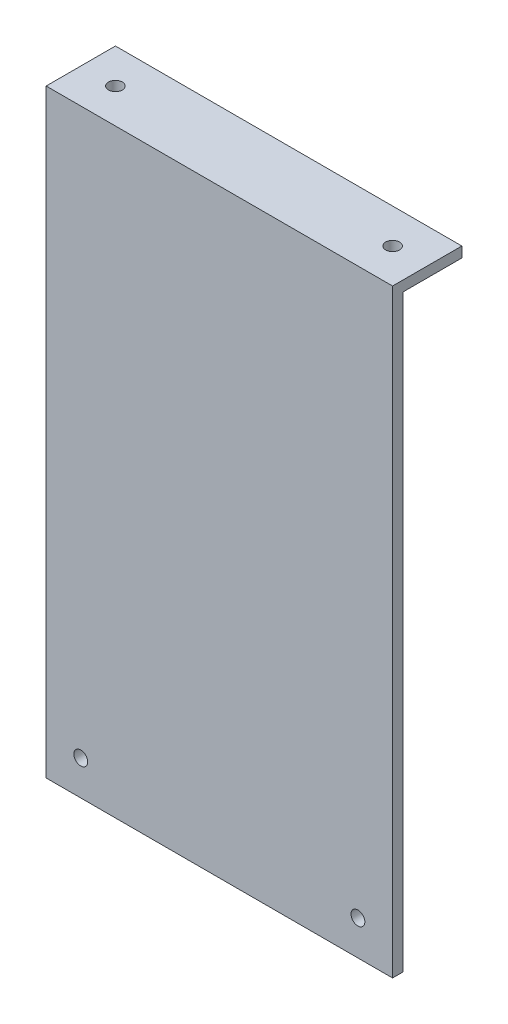
ISO-10303-21;
HEADER;
FILE_DESCRIPTION(('STEP AP214'),'2;1');
FILE_NAME('part.step','',(''),(''),'','','');
FILE_SCHEMA(('AUTOMOTIVE_DESIGN { 1 0 10303 214 1 1 1 1 }'));
ENDSEC;
DATA;
#1=APPLICATION_CONTEXT('core data for automotive mechanical design processes');
#2=APPLICATION_PROTOCOL_DEFINITION('international standard','automotive_design',2000,#1);
#3=PRODUCT_CONTEXT('',#1,'mechanical');
#4=PRODUCT('Part','Part','',(#3));
#5=PRODUCT_RELATED_PRODUCT_CATEGORY('part','',(#4));
#6=PRODUCT_DEFINITION_FORMATION('','',#4);
#7=PRODUCT_DEFINITION_CONTEXT('part definition',#1,'design');
#8=PRODUCT_DEFINITION('design','',#6,#7);
#9=PRODUCT_DEFINITION_SHAPE('','',#8);
#10=(LENGTH_UNIT() NAMED_UNIT(*) SI_UNIT(.MILLI.,.METRE.));
#11=(NAMED_UNIT(*) PLANE_ANGLE_UNIT() SI_UNIT($,.RADIAN.));
#12=(NAMED_UNIT(*) SI_UNIT($,.STERADIAN.) SOLID_ANGLE_UNIT());
#13=UNCERTAINTY_MEASURE_WITH_UNIT(LENGTH_MEASURE(1.E-05),#10,'distance_accuracy_value','');
#14=(GEOMETRIC_REPRESENTATION_CONTEXT(3) GLOBAL_UNCERTAINTY_ASSIGNED_CONTEXT((#13)) GLOBAL_UNIT_ASSIGNED_CONTEXT((#10,
#11,#12)) REPRESENTATION_CONTEXT('',''));
#15=CARTESIAN_POINT('',(0.,0.,0.));
#16=DIRECTION('',(0.,0.,1.));
#17=DIRECTION('',(1.,0.,0.));
#18=AXIS2_PLACEMENT_3D('',#15,#16,#17);
#19=CARTESIAN_POINT('',(50.,3.,10.));
#20=DIRECTION('',(-1.,0.,0.));
#21=DIRECTION('',(0.,0.,1.));
#22=AXIS2_PLACEMENT_3D('',#19,#20,#21);
#23=PLANE('',#22);
#24=DIRECTION('',(0.,-1.,0.));
#25=VECTOR('',#24,1.);
#26=CARTESIAN_POINT('',(50.,3.,10.));
#27=LINE('',#26,#25);
#28=CARTESIAN_POINT('',(50.,3.,10.));
#29=VERTEX_POINT('',#28);
#30=CARTESIAN_POINT('',(50.,-170.,10.));
#31=VERTEX_POINT('',#30);
#32=EDGE_CURVE('E161',#29,#31,#27,.T.);
#33=ORIENTED_EDGE('',*,*,#32,.T.);
#34=DIRECTION('',(0.,0.,1.));
#35=VECTOR('',#34,1.);
#36=CARTESIAN_POINT('',(50.,-170.,10.));
#37=LINE('',#36,#35);
#38=CARTESIAN_POINT('',(50.,-170.,7.));
#39=VERTEX_POINT('',#38);
#40=EDGE_CURVE('E114',#39,#31,#37,.T.);
#41=ORIENTED_EDGE('',*,*,#40,.F.);
#42=DIRECTION('',(0.,1.,0.));
#43=VECTOR('',#42,1.);
#44=CARTESIAN_POINT('',(50.,-170.,7.));
#45=LINE('',#44,#43);
#46=CARTESIAN_POINT('',(50.,0.,7.));
#47=VERTEX_POINT('',#46);
#48=EDGE_CURVE('E109',#39,#47,#45,.T.);
#49=ORIENTED_EDGE('',*,*,#48,.T.);
#50=DIRECTION('',(0.,0.,-1.));
#51=VECTOR('',#50,1.);
#52=CARTESIAN_POINT('',(50.,0.,10.));
#53=LINE('',#52,#51);
#54=CARTESIAN_POINT('',(50.,0.,-10.));
#55=VERTEX_POINT('',#54);
#56=EDGE_CURVE('E143',#47,#55,#53,.T.);
#57=ORIENTED_EDGE('',*,*,#56,.T.);
#58=DIRECTION('',(0.,-1.,0.));
#59=VECTOR('',#58,1.);
#60=CARTESIAN_POINT('',(50.,3.,-10.));
#61=LINE('',#60,#59);
#62=CARTESIAN_POINT('',(50.,3.,-10.));
#63=VERTEX_POINT('',#62);
#64=EDGE_CURVE('E11',#63,#55,#61,.T.);
#65=ORIENTED_EDGE('',*,*,#64,.F.);
#66=DIRECTION('',(0.,0.,-1.));
#67=VECTOR('',#66,1.);
#68=CARTESIAN_POINT('',(50.,3.,10.));
#69=LINE('',#68,#67);
#70=EDGE_CURVE('E151',#29,#63,#69,.T.);
#71=ORIENTED_EDGE('',*,*,#70,.F.);
#72=EDGE_LOOP('',(#33,#41,#49,#57,#65,#71));
#73=FACE_BOUND('',#72,.T.);
#74=ADVANCED_FACE('F42',(#73),#23,.F.);
#75=CARTESIAN_POINT('',(-50.,3.,-10.));
#76=DIRECTION('',(0.,0.,1.));
#77=DIRECTION('',(1.,0.,0.));
#78=AXIS2_PLACEMENT_3D('',#75,#76,#77);
#79=PLANE('',#78);
#80=DIRECTION('',(-1.,0.,0.));
#81=VECTOR('',#80,1.);
#82=CARTESIAN_POINT('',(-50.,0.,-10.));
#83=LINE('',#82,#81);
#84=CARTESIAN_POINT('',(-50.,0.,-10.));
#85=VERTEX_POINT('',#84);
#86=EDGE_CURVE('E81',#55,#85,#83,.T.);
#87=ORIENTED_EDGE('',*,*,#86,.T.);
#88=DIRECTION('',(0.,-1.,0.));
#89=VECTOR('',#88,1.);
#90=CARTESIAN_POINT('',(-50.,3.,-10.));
#91=LINE('',#90,#89);
#92=CARTESIAN_POINT('',(-50.,3.,-10.));
#93=VERTEX_POINT('',#92);
#94=EDGE_CURVE('E50',#93,#85,#91,.T.);
#95=ORIENTED_EDGE('',*,*,#94,.F.);
#96=DIRECTION('',(-1.,0.,0.));
#97=VECTOR('',#96,1.);
#98=CARTESIAN_POINT('',(-50.,3.,-10.));
#99=LINE('',#98,#97);
#100=EDGE_CURVE('E86',#63,#93,#99,.T.);
#101=ORIENTED_EDGE('',*,*,#100,.F.);
#102=ORIENTED_EDGE('',*,*,#64,.T.);
#103=EDGE_LOOP('',(#87,#95,#101,#102));
#104=FACE_BOUND('',#103,.T.);
#105=ADVANCED_FACE('F177',(#104),#79,.F.);
#106=CARTESIAN_POINT('',(-50.,3.,10.));
#107=DIRECTION('',(1.,0.,0.));
#108=DIRECTION('',(0.,0.,-1.));
#109=AXIS2_PLACEMENT_3D('',#106,#107,#108);
#110=PLANE('',#109);
#111=DIRECTION('',(0.,0.,1.));
#112=VECTOR('',#111,1.);
#113=CARTESIAN_POINT('',(-50.,0.,10.));
#114=LINE('',#113,#112);
#115=CARTESIAN_POINT('',(-50.,0.,7.));
#116=VERTEX_POINT('',#115);
#117=EDGE_CURVE('E127',#85,#116,#114,.T.);
#118=ORIENTED_EDGE('',*,*,#117,.T.);
#119=DIRECTION('',(0.,1.,0.));
#120=VECTOR('',#119,1.);
#121=CARTESIAN_POINT('',(-50.,-170.,7.));
#122=LINE('',#121,#120);
#123=CARTESIAN_POINT('',(-50.,-170.,7.));
#124=VERTEX_POINT('',#123);
#125=EDGE_CURVE('E107',#124,#116,#122,.T.);
#126=ORIENTED_EDGE('',*,*,#125,.F.);
#127=DIRECTION('',(0.,0.,-1.));
#128=VECTOR('',#127,1.);
#129=CARTESIAN_POINT('',(-50.,-170.,10.));
#130=LINE('',#129,#128);
#131=CARTESIAN_POINT('',(-50.,-170.,10.));
#132=VERTEX_POINT('',#131);
#133=EDGE_CURVE('E115',#132,#124,#130,.T.);
#134=ORIENTED_EDGE('',*,*,#133,.F.);
#135=DIRECTION('',(0.,-1.,0.));
#136=VECTOR('',#135,1.);
#137=CARTESIAN_POINT('',(-50.,3.,10.));
#138=LINE('',#137,#136);
#139=CARTESIAN_POINT('',(-50.,3.,10.));
#140=VERTEX_POINT('',#139);
#141=EDGE_CURVE('E170',#140,#132,#138,.T.);
#142=ORIENTED_EDGE('',*,*,#141,.F.);
#143=DIRECTION('',(0.,0.,1.));
#144=VECTOR('',#143,1.);
#145=CARTESIAN_POINT('',(-50.,3.,10.));
#146=LINE('',#145,#144);
#147=EDGE_CURVE('E156',#93,#140,#146,.T.);
#148=ORIENTED_EDGE('',*,*,#147,.F.);
#149=ORIENTED_EDGE('',*,*,#94,.T.);
#150=EDGE_LOOP('',(#118,#126,#134,#142,#148,#149));
#151=FACE_BOUND('',#150,.T.);
#152=ADVANCED_FACE('F126',(#151),#110,.F.);
#153=CARTESIAN_POINT('',(-50.,3.,10.));
#154=DIRECTION('',(0.,0.,-1.));
#155=DIRECTION('',(-1.,0.,0.));
#156=AXIS2_PLACEMENT_3D('',#153,#154,#155);
#157=PLANE('',#156);
#158=CARTESIAN_POINT('',(-40.,-160.,10.));
#159=DIRECTION('',(0.,0.,1.));
#160=DIRECTION('',(1.,0.,0.));
#161=AXIS2_PLACEMENT_3D('',#158,#159,#160);
#162=CIRCLE('',#161,2.);
#163=CARTESIAN_POINT('',(-38.,-160.,10.));
#164=VERTEX_POINT('',#163);
#165=EDGE_CURVE('E188',#164,#164,#162,.T.);
#166=ORIENTED_EDGE('',*,*,#165,.F.);
#167=EDGE_LOOP('',(#166));
#168=FACE_BOUND('',#167,.T.);
#169=CARTESIAN_POINT('',(40.,-160.,10.));
#170=DIRECTION('',(0.,0.,1.));
#171=DIRECTION('',(1.,0.,0.));
#172=AXIS2_PLACEMENT_3D('',#169,#170,#171);
#173=CIRCLE('',#172,2.);
#174=CARTESIAN_POINT('',(42.,-160.,10.));
#175=VERTEX_POINT('',#174);
#176=EDGE_CURVE('E194',#175,#175,#173,.T.);
#177=ORIENTED_EDGE('',*,*,#176,.F.);
#178=EDGE_LOOP('',(#177));
#179=FACE_BOUND('',#178,.T.);
#180=ORIENTED_EDGE('',*,*,#141,.T.);
#181=DIRECTION('',(-1.,0.,0.));
#182=VECTOR('',#181,1.);
#183=CARTESIAN_POINT('',(-50.,-170.,10.));
#184=LINE('',#183,#182);
#185=EDGE_CURVE('E121',#31,#132,#184,.T.);
#186=ORIENTED_EDGE('',*,*,#185,.F.);
#187=ORIENTED_EDGE('',*,*,#32,.F.);
#188=DIRECTION('',(1.,0.,0.));
#189=VECTOR('',#188,1.);
#190=CARTESIAN_POINT('',(-50.,3.,10.));
#191=LINE('',#190,#189);
#192=EDGE_CURVE('E66',#140,#29,#191,.T.);
#193=ORIENTED_EDGE('',*,*,#192,.F.);
#194=EDGE_LOOP('',(#180,#186,#187,#193));
#195=FACE_BOUND('',#194,.T.);
#196=ADVANCED_FACE('F208',(#168,#179,#195),#157,.F.);
#197=CARTESIAN_POINT('',(0.,3.,0.));
#198=DIRECTION('',(0.,-1.,0.));
#199=DIRECTION('',(0.,0.,-1.));
#200=AXIS2_PLACEMENT_3D('',#197,#198,#199);
#201=PLANE('',#200);
#202=CARTESIAN_POINT('',(40.,3.,0.));
#203=DIRECTION('',(0.,1.,0.));
#204=DIRECTION('',(0.,0.,1.));
#205=AXIS2_PLACEMENT_3D('',#202,#203,#204);
#206=CIRCLE('',#205,2.);
#207=CARTESIAN_POINT('',(40.,3.,2.));
#208=VERTEX_POINT('',#207);
#209=EDGE_CURVE('E139',#208,#208,#206,.T.);
#210=ORIENTED_EDGE('',*,*,#209,.F.);
#211=EDGE_LOOP('',(#210));
#212=FACE_BOUND('',#211,.T.);
#213=CARTESIAN_POINT('',(-40.,3.,0.));
#214=DIRECTION('',(0.,1.,0.));
#215=DIRECTION('',(0.,0.,1.));
#216=AXIS2_PLACEMENT_3D('',#213,#214,#215);
#217=CIRCLE('',#216,2.);
#218=CARTESIAN_POINT('',(-40.,3.,2.));
#219=VERTEX_POINT('',#218);
#220=EDGE_CURVE('E129',#219,#219,#217,.T.);
#221=ORIENTED_EDGE('',*,*,#220,.F.);
#222=EDGE_LOOP('',(#221));
#223=FACE_BOUND('',#222,.T.);
#224=ORIENTED_EDGE('',*,*,#70,.T.);
#225=ORIENTED_EDGE('',*,*,#100,.T.);
#226=ORIENTED_EDGE('',*,*,#147,.T.);
#227=ORIENTED_EDGE('',*,*,#192,.T.);
#228=EDGE_LOOP('',(#224,#225,#226,#227));
#229=FACE_BOUND('',#228,.T.);
#230=ADVANCED_FACE('F211',(#212,#223,#229),#201,.F.);
#231=CARTESIAN_POINT('',(0.,0.,0.));
#232=DIRECTION('',(0.,-1.,0.));
#233=DIRECTION('',(0.,0.,-1.));
#234=AXIS2_PLACEMENT_3D('',#231,#232,#233);
#235=PLANE('',#234);
#236=DIRECTION('',(1.,0.,0.));
#237=VECTOR('',#236,1.);
#238=CARTESIAN_POINT('',(-50.,0.,7.));
#239=LINE('',#238,#237);
#240=EDGE_CURVE('E57',#116,#47,#239,.T.);
#241=ORIENTED_EDGE('',*,*,#240,.F.);
#242=ORIENTED_EDGE('',*,*,#117,.F.);
#243=ORIENTED_EDGE('',*,*,#86,.F.);
#244=ORIENTED_EDGE('',*,*,#56,.F.);
#245=EDGE_LOOP('',(#241,#242,#243,#244));
#246=FACE_BOUND('',#245,.T.);
#247=CARTESIAN_POINT('',(40.,0.,0.));
#248=DIRECTION('',(0.,-1.,0.));
#249=DIRECTION('',(0.,0.,-1.));
#250=AXIS2_PLACEMENT_3D('',#247,#248,#249);
#251=CIRCLE('',#250,2.);
#252=CARTESIAN_POINT('',(40.,0.,2.));
#253=VERTEX_POINT('',#252);
#254=EDGE_CURVE('E144',#253,#253,#251,.F.);
#255=ORIENTED_EDGE('',*,*,#254,.T.);
#256=EDGE_LOOP('',(#255));
#257=FACE_BOUND('',#256,.T.);
#258=CARTESIAN_POINT('',(-40.,0.,0.));
#259=DIRECTION('',(0.,-1.,0.));
#260=DIRECTION('',(0.,0.,-1.));
#261=AXIS2_PLACEMENT_3D('',#258,#259,#260);
#262=CIRCLE('',#261,2.);
#263=CARTESIAN_POINT('',(-40.,0.,2.));
#264=VERTEX_POINT('',#263);
#265=EDGE_CURVE('E134',#264,#264,#262,.F.);
#266=ORIENTED_EDGE('',*,*,#265,.T.);
#267=EDGE_LOOP('',(#266));
#268=FACE_BOUND('',#267,.T.);
#269=ADVANCED_FACE('F174',(#246,#257,#268),#235,.T.);
#270=CARTESIAN_POINT('',(-40.,-0.00100000000000013,0.));
#271=DIRECTION('',(0.,1.,0.));
#272=DIRECTION('',(0.,0.,1.));
#273=AXIS2_PLACEMENT_3D('',#270,#271,#272);
#274=CYLINDRICAL_SURFACE('',#273,2.);
#275=CARTESIAN_POINT('',(-40.,0.,2.));
#276=CARTESIAN_POINT('',(-40.,0.03125,2.));
#277=CARTESIAN_POINT('',(-40.,0.0625,2.));
#278=CARTESIAN_POINT('',(-40.,0.125,2.));
#279=CARTESIAN_POINT('',(-40.,0.15625,2.));
#280=CARTESIAN_POINT('',(-40.,0.21875,2.));
#281=CARTESIAN_POINT('',(-40.,0.25,2.));
#282=CARTESIAN_POINT('',(-40.,0.3125,2.));
#283=CARTESIAN_POINT('',(-40.,0.34375,2.));
#284=CARTESIAN_POINT('',(-40.,0.40625,2.));
#285=CARTESIAN_POINT('',(-40.,0.4375,2.));
#286=CARTESIAN_POINT('',(-40.,0.5,2.));
#287=CARTESIAN_POINT('',(-40.,0.53125,2.));
#288=CARTESIAN_POINT('',(-40.,0.59375,2.));
#289=CARTESIAN_POINT('',(-40.,0.625,2.));
#290=CARTESIAN_POINT('',(-40.,0.6875,2.));
#291=CARTESIAN_POINT('',(-40.,0.71875,2.));
#292=CARTESIAN_POINT('',(-40.,0.78125,2.));
#293=CARTESIAN_POINT('',(-40.,0.8125,2.));
#294=CARTESIAN_POINT('',(-40.,0.875,2.));
#295=CARTESIAN_POINT('',(-40.,0.90625,2.));
#296=CARTESIAN_POINT('',(-40.,0.96875,2.));
#297=CARTESIAN_POINT('',(-40.,1.,2.));
#298=CARTESIAN_POINT('',(-40.,1.0625,2.));
#299=CARTESIAN_POINT('',(-40.,1.09375,2.));
#300=CARTESIAN_POINT('',(-40.,1.15625,2.));
#301=CARTESIAN_POINT('',(-40.,1.1875,2.));
#302=CARTESIAN_POINT('',(-40.,1.25,2.));
#303=CARTESIAN_POINT('',(-40.,1.28125,2.));
#304=CARTESIAN_POINT('',(-40.,1.34375,2.));
#305=CARTESIAN_POINT('',(-40.,1.375,2.));
#306=CARTESIAN_POINT('',(-40.,1.4375,2.));
#307=CARTESIAN_POINT('',(-40.,1.46875,2.));
#308=CARTESIAN_POINT('',(-40.,1.53125,2.));
#309=CARTESIAN_POINT('',(-40.,1.5625,2.));
#310=CARTESIAN_POINT('',(-40.,1.625,2.));
#311=CARTESIAN_POINT('',(-40.,1.65625,2.));
#312=CARTESIAN_POINT('',(-40.,1.71875,2.));
#313=CARTESIAN_POINT('',(-40.,1.75,2.));
#314=CARTESIAN_POINT('',(-40.,1.8125,2.));
#315=CARTESIAN_POINT('',(-40.,1.84375,2.));
#316=CARTESIAN_POINT('',(-40.,1.90625,2.));
#317=CARTESIAN_POINT('',(-40.,1.9375,2.));
#318=CARTESIAN_POINT('',(-40.,2.,2.));
#319=CARTESIAN_POINT('',(-40.,2.03125,2.));
#320=CARTESIAN_POINT('',(-40.,2.09375,2.));
#321=CARTESIAN_POINT('',(-40.,2.125,2.));
#322=CARTESIAN_POINT('',(-40.,2.1875,2.));
#323=CARTESIAN_POINT('',(-40.,2.21875,2.));
#324=CARTESIAN_POINT('',(-40.,2.28125,2.));
#325=CARTESIAN_POINT('',(-40.,2.3125,2.));
#326=CARTESIAN_POINT('',(-40.,2.375,2.));
#327=CARTESIAN_POINT('',(-40.,2.40625,2.));
#328=CARTESIAN_POINT('',(-40.,2.46875,2.));
#329=CARTESIAN_POINT('',(-40.,2.5,2.));
#330=CARTESIAN_POINT('',(-40.,2.5625,2.));
#331=CARTESIAN_POINT('',(-40.,2.59375,2.));
#332=CARTESIAN_POINT('',(-40.,2.65625,2.));
#333=CARTESIAN_POINT('',(-40.,2.6875,2.));
#334=CARTESIAN_POINT('',(-40.,2.75,2.));
#335=CARTESIAN_POINT('',(-40.,2.78125,2.));
#336=CARTESIAN_POINT('',(-40.,2.84375,2.));
#337=CARTESIAN_POINT('',(-40.,2.875,2.));
#338=CARTESIAN_POINT('',(-40.,2.9375,2.));
#339=CARTESIAN_POINT('',(-40.,2.96875,2.));
#340=CARTESIAN_POINT('',(-40.,3.,2.));
#341=B_SPLINE_CURVE_WITH_KNOTS('',3,(#275,#276,#277,#278,#279,#280,#281,#282,#283,#284,#285,
#286,#287,#288,#289,#290,#291,#292,#293,#294,#295,#296,#297,#298,#299,#300,#301,#302,#303,#304,
#305,#306,#307,#308,#309,#310,#311,#312,#313,#314,#315,#316,#317,#318,#319,#320,#321,#322,#323,
#324,#325,#326,#327,#328,#329,#330,#331,#332,#333,#334,#335,#336,#337,#338,#339,#340),
.UNSPECIFIED.,.F.,.F.,(4,2,2,2,2,2,2,2,2,2,2,2,2,2,2,2,2,2,2,2,2,2,2,2,2,2,2,2,2,2,2,2,4),(0.,
0.09375,0.1875,0.28125,0.375,0.46875,0.5625,0.65625,0.75,0.84375,0.9375,1.03125,1.125,1.21875,
1.3125,1.40625,1.5,1.59375,1.6875,1.78125,1.875,1.96875,2.0625,2.15625,2.25,2.34375,2.4375,
2.53125,2.625,2.71875,2.8125,2.90625,3.),.UNSPECIFIED.);
#342=EDGE_CURVE('BSEAM248',#264,#219,#341,.T.);
#343=ORIENTED_EDGE('',*,*,#265,.F.);
#344=ORIENTED_EDGE('',*,*,#220,.T.);
#345=ORIENTED_EDGE('',*,*,#342,.T.);
#346=ORIENTED_EDGE('',*,*,#342,.F.);
#347=EDGE_LOOP('',(#343,#345,#344,#346));
#348=FACE_BOUND('',#347,.T.);
#349=ADVANCED_FACE('F248',(#348),#274,.F.);
#350=CARTESIAN_POINT('',(40.,-0.00100000000000013,0.));
#351=DIRECTION('',(0.,1.,0.));
#352=DIRECTION('',(0.,0.,1.));
#353=AXIS2_PLACEMENT_3D('',#350,#351,#352);
#354=CYLINDRICAL_SURFACE('',#353,2.);
#355=CARTESIAN_POINT('',(40.,0.,2.));
#356=CARTESIAN_POINT('',(40.,0.03125,2.));
#357=CARTESIAN_POINT('',(40.,0.0625,2.));
#358=CARTESIAN_POINT('',(40.,0.125,2.));
#359=CARTESIAN_POINT('',(40.,0.15625,2.));
#360=CARTESIAN_POINT('',(40.,0.21875,2.));
#361=CARTESIAN_POINT('',(40.,0.25,2.));
#362=CARTESIAN_POINT('',(40.,0.3125,2.));
#363=CARTESIAN_POINT('',(40.,0.34375,2.));
#364=CARTESIAN_POINT('',(40.,0.40625,2.));
#365=CARTESIAN_POINT('',(40.,0.4375,2.));
#366=CARTESIAN_POINT('',(40.,0.5,2.));
#367=CARTESIAN_POINT('',(40.,0.53125,2.));
#368=CARTESIAN_POINT('',(40.,0.59375,2.));
#369=CARTESIAN_POINT('',(40.,0.625,2.));
#370=CARTESIAN_POINT('',(40.,0.6875,2.));
#371=CARTESIAN_POINT('',(40.,0.71875,2.));
#372=CARTESIAN_POINT('',(40.,0.78125,2.));
#373=CARTESIAN_POINT('',(40.,0.8125,2.));
#374=CARTESIAN_POINT('',(40.,0.875,2.));
#375=CARTESIAN_POINT('',(40.,0.90625,2.));
#376=CARTESIAN_POINT('',(40.,0.96875,2.));
#377=CARTESIAN_POINT('',(40.,1.,2.));
#378=CARTESIAN_POINT('',(40.,1.0625,2.));
#379=CARTESIAN_POINT('',(40.,1.09375,2.));
#380=CARTESIAN_POINT('',(40.,1.15625,2.));
#381=CARTESIAN_POINT('',(40.,1.1875,2.));
#382=CARTESIAN_POINT('',(40.,1.25,2.));
#383=CARTESIAN_POINT('',(40.,1.28125,2.));
#384=CARTESIAN_POINT('',(40.,1.34375,2.));
#385=CARTESIAN_POINT('',(40.,1.375,2.));
#386=CARTESIAN_POINT('',(40.,1.4375,2.));
#387=CARTESIAN_POINT('',(40.,1.46875,2.));
#388=CARTESIAN_POINT('',(40.,1.53125,2.));
#389=CARTESIAN_POINT('',(40.,1.5625,2.));
#390=CARTESIAN_POINT('',(40.,1.625,2.));
#391=CARTESIAN_POINT('',(40.,1.65625,2.));
#392=CARTESIAN_POINT('',(40.,1.71875,2.));
#393=CARTESIAN_POINT('',(40.,1.75,2.));
#394=CARTESIAN_POINT('',(40.,1.8125,2.));
#395=CARTESIAN_POINT('',(40.,1.84375,2.));
#396=CARTESIAN_POINT('',(40.,1.90625,2.));
#397=CARTESIAN_POINT('',(40.,1.9375,2.));
#398=CARTESIAN_POINT('',(40.,2.,2.));
#399=CARTESIAN_POINT('',(40.,2.03125,2.));
#400=CARTESIAN_POINT('',(40.,2.09375,2.));
#401=CARTESIAN_POINT('',(40.,2.125,2.));
#402=CARTESIAN_POINT('',(40.,2.1875,2.));
#403=CARTESIAN_POINT('',(40.,2.21875,2.));
#404=CARTESIAN_POINT('',(40.,2.28125,2.));
#405=CARTESIAN_POINT('',(40.,2.3125,2.));
#406=CARTESIAN_POINT('',(40.,2.375,2.));
#407=CARTESIAN_POINT('',(40.,2.40625,2.));
#408=CARTESIAN_POINT('',(40.,2.46875,2.));
#409=CARTESIAN_POINT('',(40.,2.5,2.));
#410=CARTESIAN_POINT('',(40.,2.5625,2.));
#411=CARTESIAN_POINT('',(40.,2.59375,2.));
#412=CARTESIAN_POINT('',(40.,2.65625,2.));
#413=CARTESIAN_POINT('',(40.,2.6875,2.));
#414=CARTESIAN_POINT('',(40.,2.75,2.));
#415=CARTESIAN_POINT('',(40.,2.78125,2.));
#416=CARTESIAN_POINT('',(40.,2.84375,2.));
#417=CARTESIAN_POINT('',(40.,2.875,2.));
#418=CARTESIAN_POINT('',(40.,2.9375,2.));
#419=CARTESIAN_POINT('',(40.,2.96875,2.));
#420=CARTESIAN_POINT('',(40.,3.,2.));
#421=B_SPLINE_CURVE_WITH_KNOTS('',3,(#355,#356,#357,#358,#359,#360,#361,#362,#363,#364,#365,
#366,#367,#368,#369,#370,#371,#372,#373,#374,#375,#376,#377,#378,#379,#380,#381,#382,#383,#384,
#385,#386,#387,#388,#389,#390,#391,#392,#393,#394,#395,#396,#397,#398,#399,#400,#401,#402,#403,
#404,#405,#406,#407,#408,#409,#410,#411,#412,#413,#414,#415,#416,#417,#418,#419,#420),
.UNSPECIFIED.,.F.,.F.,(4,2,2,2,2,2,2,2,2,2,2,2,2,2,2,2,2,2,2,2,2,2,2,2,2,2,2,2,2,2,2,2,4),(0.,
0.09375,0.1875,0.28125,0.375,0.46875,0.5625,0.65625,0.75,0.84375,0.9375,1.03125,1.125,1.21875,
1.3125,1.40625,1.5,1.59375,1.6875,1.78125,1.875,1.96875,2.0625,2.15625,2.25,2.34375,2.4375,
2.53125,2.625,2.71875,2.8125,2.90625,3.),.UNSPECIFIED.);
#422=EDGE_CURVE('BSEAM275',#253,#208,#421,.T.);
#423=ORIENTED_EDGE('',*,*,#254,.F.);
#424=ORIENTED_EDGE('',*,*,#209,.T.);
#425=ORIENTED_EDGE('',*,*,#422,.T.);
#426=ORIENTED_EDGE('',*,*,#422,.F.);
#427=EDGE_LOOP('',(#423,#425,#424,#426));
#428=FACE_BOUND('',#427,.T.);
#429=ADVANCED_FACE('F275',(#428),#354,.F.);
#430=CARTESIAN_POINT('',(-50.,-170.,7.));
#431=DIRECTION('',(0.,0.,1.));
#432=DIRECTION('',(1.,0.,0.));
#433=AXIS2_PLACEMENT_3D('',#430,#431,#432);
#434=PLANE('',#433);
#435=CARTESIAN_POINT('',(-40.,-160.,7.));
#436=DIRECTION('',(0.,0.,1.));
#437=DIRECTION('',(1.,0.,0.));
#438=AXIS2_PLACEMENT_3D('',#435,#436,#437);
#439=CIRCLE('',#438,2.);
#440=CARTESIAN_POINT('',(-38.,-160.,7.));
#441=VERTEX_POINT('',#440);
#442=EDGE_CURVE('E185',#441,#441,#439,.F.);
#443=ORIENTED_EDGE('',*,*,#442,.F.);
#444=EDGE_LOOP('',(#443));
#445=FACE_BOUND('',#444,.T.);
#446=CARTESIAN_POINT('',(40.,-160.,7.));
#447=DIRECTION('',(0.,0.,1.));
#448=DIRECTION('',(1.,0.,0.));
#449=AXIS2_PLACEMENT_3D('',#446,#447,#448);
#450=CIRCLE('',#449,2.);
#451=CARTESIAN_POINT('',(42.,-160.,7.));
#452=VERTEX_POINT('',#451);
#453=EDGE_CURVE('E197',#452,#452,#450,.F.);
#454=ORIENTED_EDGE('',*,*,#453,.F.);
#455=EDGE_LOOP('',(#454));
#456=FACE_BOUND('',#455,.T.);
#457=ORIENTED_EDGE('',*,*,#240,.T.);
#458=ORIENTED_EDGE('',*,*,#48,.F.);
#459=DIRECTION('',(1.,0.,0.));
#460=VECTOR('',#459,1.);
#461=CARTESIAN_POINT('',(-50.,-170.,7.));
#462=LINE('',#461,#460);
#463=EDGE_CURVE('E103',#124,#39,#462,.T.);
#464=ORIENTED_EDGE('',*,*,#463,.F.);
#465=ORIENTED_EDGE('',*,*,#125,.T.);
#466=EDGE_LOOP('',(#457,#458,#464,#465));
#467=FACE_BOUND('',#466,.T.);
#468=ADVANCED_FACE('F105',(#445,#456,#467),#434,.F.);
#469=CARTESIAN_POINT('',(0.,-170.,0.));
#470=DIRECTION('',(0.,-1.,0.));
#471=DIRECTION('',(0.,0.,-1.));
#472=AXIS2_PLACEMENT_3D('',#469,#470,#471);
#473=PLANE('',#472);
#474=ORIENTED_EDGE('',*,*,#133,.T.);
#475=ORIENTED_EDGE('',*,*,#463,.T.);
#476=ORIENTED_EDGE('',*,*,#40,.T.);
#477=ORIENTED_EDGE('',*,*,#185,.T.);
#478=EDGE_LOOP('',(#474,#475,#476,#477));
#479=FACE_BOUND('',#478,.T.);
#480=ADVANCED_FACE('F119',(#479),#473,.T.);
#481=CARTESIAN_POINT('',(40.,-160.,-10.001));
#482=DIRECTION('',(0.,0.,1.));
#483=DIRECTION('',(1.,0.,0.));
#484=AXIS2_PLACEMENT_3D('',#481,#482,#483);
#485=CYLINDRICAL_SURFACE('',#484,2.);
#486=ORIENTED_EDGE('',*,*,#176,.T.);
#487=EDGE_LOOP('',(#486));
#488=FACE_BOUND('',#487,.T.);
#489=ORIENTED_EDGE('',*,*,#453,.T.);
#490=EDGE_LOOP('',(#489));
#491=FACE_BOUND('',#490,.T.);
#492=ADVANCED_FACE('F205',(#488,#491),#485,.F.);
#493=CARTESIAN_POINT('',(-40.,-160.,-10.001));
#494=DIRECTION('',(0.,0.,1.));
#495=DIRECTION('',(1.,0.,0.));
#496=AXIS2_PLACEMENT_3D('',#493,#494,#495);
#497=CYLINDRICAL_SURFACE('',#496,2.);
#498=ORIENTED_EDGE('',*,*,#165,.T.);
#499=EDGE_LOOP('',(#498));
#500=FACE_BOUND('',#499,.T.);
#501=ORIENTED_EDGE('',*,*,#442,.T.);
#502=EDGE_LOOP('',(#501));
#503=FACE_BOUND('',#502,.T.);
#504=ADVANCED_FACE('F285',(#500,#503),#497,.F.);
#505=CLOSED_SHELL('',(#74,#105,#152,#196,#230,#269,#349,#429,#468,#480,#492,#504));
#506=MANIFOLD_SOLID_BREP('B2',#505);
#507=ADVANCED_BREP_SHAPE_REPRESENTATION('',(#18,#506),#14);
#508=SHAPE_DEFINITION_REPRESENTATION(#9,#507);
ENDSEC;
END-ISO-10303-21;
